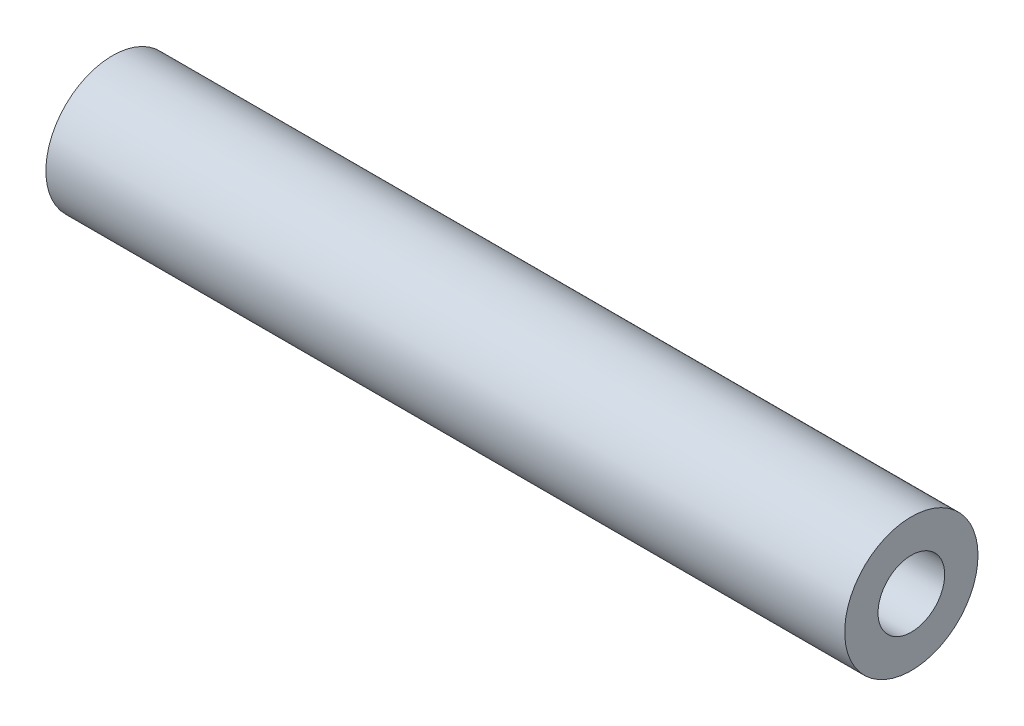
ISO-10303-21;
HEADER;
FILE_DESCRIPTION(('STEP AP214'),'2;1');
FILE_NAME('part.step','',(''),(''),'','','');
FILE_SCHEMA(('AUTOMOTIVE_DESIGN { 1 0 10303 214 1 1 1 1 }'));
ENDSEC;
DATA;
#1=APPLICATION_CONTEXT('core data for automotive mechanical design processes');
#2=APPLICATION_PROTOCOL_DEFINITION('international standard','automotive_design',2000,#1);
#3=PRODUCT_CONTEXT('',#1,'mechanical');
#4=PRODUCT('Part','Part','',(#3));
#5=PRODUCT_RELATED_PRODUCT_CATEGORY('part','',(#4));
#6=PRODUCT_DEFINITION_FORMATION('','',#4);
#7=PRODUCT_DEFINITION_CONTEXT('part definition',#1,'design');
#8=PRODUCT_DEFINITION('design','',#6,#7);
#9=PRODUCT_DEFINITION_SHAPE('','',#8);
#10=(LENGTH_UNIT() NAMED_UNIT(*) SI_UNIT(.MILLI.,.METRE.));
#11=(NAMED_UNIT(*) PLANE_ANGLE_UNIT() SI_UNIT($,.RADIAN.));
#12=(NAMED_UNIT(*) SI_UNIT($,.STERADIAN.) SOLID_ANGLE_UNIT());
#13=UNCERTAINTY_MEASURE_WITH_UNIT(LENGTH_MEASURE(1.E-05),#10,'distance_accuracy_value','');
#14=(GEOMETRIC_REPRESENTATION_CONTEXT(3) GLOBAL_UNCERTAINTY_ASSIGNED_CONTEXT((#13)) GLOBAL_UNIT_ASSIGNED_CONTEXT((#10,
#11,#12)) REPRESENTATION_CONTEXT('',''));
#15=CARTESIAN_POINT('',(0.,0.,0.));
#16=DIRECTION('',(0.,0.,1.));
#17=DIRECTION('',(1.,0.,0.));
#18=AXIS2_PLACEMENT_3D('',#15,#16,#17);
#19=CARTESIAN_POINT('',(14.98,0.,0.));
#20=DIRECTION('',(1.,0.,0.));
#21=DIRECTION('',(0.,0.,-1.));
#22=AXIS2_PLACEMENT_3D('',#19,#20,#21);
#23=PLANE('',#22);
#24=CARTESIAN_POINT('',(14.98,0.,0.));
#25=DIRECTION('',(1.,0.,0.));
#26=DIRECTION('',(0.,0.,-1.));
#27=AXIS2_PLACEMENT_3D('',#24,#25,#26);
#28=CIRCLE('',#27,1.25);
#29=CARTESIAN_POINT('',(14.98,0.,-1.25));
#30=VERTEX_POINT('',#29);
#31=EDGE_CURVE('E52',#30,#30,#28,.T.);
#32=ORIENTED_EDGE('',*,*,#31,.F.);
#33=EDGE_LOOP('',(#32));
#34=FACE_BOUND('',#33,.T.);
#35=CARTESIAN_POINT('',(14.98,0.,0.));
#36=DIRECTION('',(1.,0.,0.));
#37=DIRECTION('',(0.,0.,-1.));
#38=AXIS2_PLACEMENT_3D('',#35,#36,#37);
#39=CIRCLE('',#38,2.5);
#40=CARTESIAN_POINT('',(14.98,0.,-2.5));
#41=VERTEX_POINT('',#40);
#42=EDGE_CURVE('E10',#41,#41,#39,.T.);
#43=ORIENTED_EDGE('',*,*,#42,.T.);
#44=EDGE_LOOP('',(#43));
#45=FACE_BOUND('',#44,.T.);
#46=ADVANCED_FACE('F30',(#34,#45),#23,.T.);
#47=CARTESIAN_POINT('',(-14.98,0.,0.));
#48=DIRECTION('',(1.,0.,0.));
#49=DIRECTION('',(0.,0.,-1.));
#50=AXIS2_PLACEMENT_3D('',#47,#48,#49);
#51=PLANE('',#50);
#52=CARTESIAN_POINT('',(-14.98,0.,0.));
#53=DIRECTION('',(-1.,0.,0.));
#54=DIRECTION('',(0.,0.,1.));
#55=AXIS2_PLACEMENT_3D('',#52,#53,#54);
#56=CIRCLE('',#55,1.25);
#57=CARTESIAN_POINT('',(-14.98,0.,1.25));
#58=VERTEX_POINT('',#57);
#59=EDGE_CURVE('E63',#58,#58,#56,.T.);
#60=ORIENTED_EDGE('',*,*,#59,.F.);
#61=EDGE_LOOP('',(#60));
#62=FACE_BOUND('',#61,.T.);
#63=CARTESIAN_POINT('',(-14.98,0.,0.));
#64=DIRECTION('',(1.,0.,0.));
#65=DIRECTION('',(0.,0.,-1.));
#66=AXIS2_PLACEMENT_3D('',#63,#64,#65);
#67=CIRCLE('',#66,2.5);
#68=CARTESIAN_POINT('',(-14.98,0.,-2.5));
#69=VERTEX_POINT('',#68);
#70=EDGE_CURVE('E38',#69,#69,#67,.T.);
#71=ORIENTED_EDGE('',*,*,#70,.F.);
#72=EDGE_LOOP('',(#71));
#73=FACE_BOUND('',#72,.T.);
#74=ADVANCED_FACE('F69',(#62,#73),#51,.F.);
#75=CARTESIAN_POINT('',(14.98,0.,0.));
#76=DIRECTION('',(-1.,0.,0.));
#77=DIRECTION('',(0.,0.,1.));
#78=AXIS2_PLACEMENT_3D('',#75,#76,#77);
#79=CYLINDRICAL_SURFACE('',#78,2.5);
#80=ORIENTED_EDGE('',*,*,#42,.F.);
#81=EDGE_LOOP('',(#80));
#82=FACE_BOUND('',#81,.T.);
#83=ORIENTED_EDGE('',*,*,#70,.T.);
#84=EDGE_LOOP('',(#83));
#85=FACE_BOUND('',#84,.T.);
#86=ADVANCED_FACE('F32',(#82,#85),#79,.T.);
#87=CARTESIAN_POINT('',(14.98,0.,0.));
#88=DIRECTION('',(-1.,0.,0.));
#89=DIRECTION('',(0.,0.,1.));
#90=AXIS2_PLACEMENT_3D('',#87,#88,#89);
#91=CYLINDRICAL_SURFACE('',#90,1.);
#92=CARTESIAN_POINT('',(-6.82978484524311,0.,0.));
#93=DIRECTION('',(-1.,0.,0.));
#94=DIRECTION('',(0.,0.,1.));
#95=AXIS2_PLACEMENT_3D('',#92,#93,#94);
#96=CIRCLE('',#95,1.);
#97=CARTESIAN_POINT('',(-6.82978484524311,0.,1.));
#98=VERTEX_POINT('',#97);
#99=EDGE_CURVE('E34',#98,#98,#96,.F.);
#100=ORIENTED_EDGE('',*,*,#99,.F.);
#101=EDGE_LOOP('',(#100));
#102=FACE_BOUND('',#101,.T.);
#103=CARTESIAN_POINT('',(6.82978484524311,0.,0.));
#104=DIRECTION('',(1.,0.,0.));
#105=DIRECTION('',(0.,0.,-1.));
#106=AXIS2_PLACEMENT_3D('',#103,#104,#105);
#107=CIRCLE('',#106,1.);
#108=CARTESIAN_POINT('',(6.82978484524311,0.,-1.));
#109=VERTEX_POINT('',#108);
#110=EDGE_CURVE('E43',#109,#109,#107,.F.);
#111=ORIENTED_EDGE('',*,*,#110,.F.);
#112=EDGE_LOOP('',(#111));
#113=FACE_BOUND('',#112,.T.);
#114=ADVANCED_FACE('F75',(#102,#113),#91,.F.);
#115=CARTESIAN_POINT('',(6.98,0.,0.));
#116=DIRECTION('',(1.,0.,0.));
#117=DIRECTION('',(0.,0.,-1.));
#118=AXIS2_PLACEMENT_3D('',#115,#116,#117);
#119=CONICAL_SURFACE('',#118,1.25,1.02974425867665);
#120=ORIENTED_EDGE('',*,*,#110,.T.);
#121=EDGE_LOOP('',(#120));
#122=FACE_BOUND('',#121,.T.);
#123=CARTESIAN_POINT('',(6.98,0.,0.));
#124=DIRECTION('',(1.,0.,0.));
#125=DIRECTION('',(0.,0.,-1.));
#126=AXIS2_PLACEMENT_3D('',#123,#124,#125);
#127=CIRCLE('',#126,1.25);
#128=CARTESIAN_POINT('',(6.98,0.,-1.25));
#129=VERTEX_POINT('',#128);
#130=EDGE_CURVE('E46',#129,#129,#127,.T.);
#131=ORIENTED_EDGE('',*,*,#130,.T.);
#132=EDGE_LOOP('',(#131));
#133=FACE_BOUND('',#132,.T.);
#134=ADVANCED_FACE('F80',(#122,#133),#119,.F.);
#135=CARTESIAN_POINT('',(14.98,0.,0.));
#136=DIRECTION('',(1.,0.,0.));
#137=DIRECTION('',(0.,0.,-1.));
#138=AXIS2_PLACEMENT_3D('',#135,#136,#137);
#139=CYLINDRICAL_SURFACE('',#138,1.25);
#140=ORIENTED_EDGE('',*,*,#130,.F.);
#141=EDGE_LOOP('',(#140));
#142=FACE_BOUND('',#141,.T.);
#143=ORIENTED_EDGE('',*,*,#31,.T.);
#144=EDGE_LOOP('',(#143));
#145=FACE_BOUND('',#144,.T.);
#146=ADVANCED_FACE('F91',(#142,#145),#139,.F.);
#147=CARTESIAN_POINT('',(-6.98,0.,0.));
#148=DIRECTION('',(-1.,0.,0.));
#149=DIRECTION('',(0.,0.,1.));
#150=AXIS2_PLACEMENT_3D('',#147,#148,#149);
#151=CONICAL_SURFACE('',#150,1.25,1.02974425867665);
#152=ORIENTED_EDGE('',*,*,#99,.T.);
#153=EDGE_LOOP('',(#152));
#154=FACE_BOUND('',#153,.T.);
#155=CARTESIAN_POINT('',(-6.98,0.,0.));
#156=DIRECTION('',(-1.,0.,0.));
#157=DIRECTION('',(0.,0.,1.));
#158=AXIS2_PLACEMENT_3D('',#155,#156,#157);
#159=CIRCLE('',#158,1.25);
#160=CARTESIAN_POINT('',(-6.98,0.,1.25));
#161=VERTEX_POINT('',#160);
#162=EDGE_CURVE('E59',#161,#161,#159,.T.);
#163=ORIENTED_EDGE('',*,*,#162,.T.);
#164=EDGE_LOOP('',(#163));
#165=FACE_BOUND('',#164,.T.);
#166=ADVANCED_FACE('F94',(#154,#165),#151,.F.);
#167=CARTESIAN_POINT('',(-14.98,0.,0.));
#168=DIRECTION('',(-1.,0.,0.));
#169=DIRECTION('',(0.,0.,1.));
#170=AXIS2_PLACEMENT_3D('',#167,#168,#169);
#171=CYLINDRICAL_SURFACE('',#170,1.25);
#172=ORIENTED_EDGE('',*,*,#162,.F.);
#173=EDGE_LOOP('',(#172));
#174=FACE_BOUND('',#173,.T.);
#175=ORIENTED_EDGE('',*,*,#59,.T.);
#176=EDGE_LOOP('',(#175));
#177=FACE_BOUND('',#176,.T.);
#178=ADVANCED_FACE('F67',(#174,#177),#171,.F.);
#179=CLOSED_SHELL('',(#46,#74,#86,#114,#134,#146,#166,#178));
#180=MANIFOLD_SOLID_BREP('B2',#179);
#181=ADVANCED_BREP_SHAPE_REPRESENTATION('',(#18,#180),#14);
#182=SHAPE_DEFINITION_REPRESENTATION(#9,#181);
ENDSEC;
END-ISO-10303-21;
